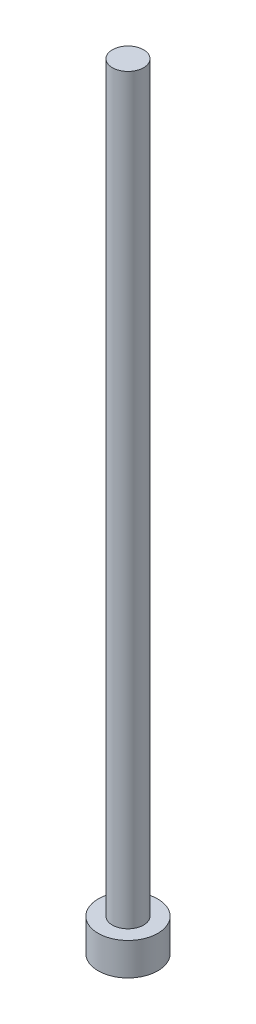
ISO-10303-21;
HEADER;
FILE_DESCRIPTION(('STEP AP214'),'2;1');
FILE_NAME('part.step','',(''),(''),'','','');
FILE_SCHEMA(('AUTOMOTIVE_DESIGN { 1 0 10303 214 1 1 1 1 }'));
ENDSEC;
DATA;
#1=APPLICATION_CONTEXT('core data for automotive mechanical design processes');
#2=APPLICATION_PROTOCOL_DEFINITION('international standard','automotive_design',2000,#1);
#3=PRODUCT_CONTEXT('',#1,'mechanical');
#4=PRODUCT('Part','Part','',(#3));
#5=PRODUCT_RELATED_PRODUCT_CATEGORY('part','',(#4));
#6=PRODUCT_DEFINITION_FORMATION('','',#4);
#7=PRODUCT_DEFINITION_CONTEXT('part definition',#1,'design');
#8=PRODUCT_DEFINITION('design','',#6,#7);
#9=PRODUCT_DEFINITION_SHAPE('','',#8);
#10=(LENGTH_UNIT() NAMED_UNIT(*) SI_UNIT(.MILLI.,.METRE.));
#11=(NAMED_UNIT(*) PLANE_ANGLE_UNIT() SI_UNIT($,.RADIAN.));
#12=(NAMED_UNIT(*) SI_UNIT($,.STERADIAN.) SOLID_ANGLE_UNIT());
#13=UNCERTAINTY_MEASURE_WITH_UNIT(LENGTH_MEASURE(1.E-05),#10,'distance_accuracy_value','');
#14=(GEOMETRIC_REPRESENTATION_CONTEXT(3) GLOBAL_UNCERTAINTY_ASSIGNED_CONTEXT((#13)) GLOBAL_UNIT_ASSIGNED_CONTEXT((#10,
#11,#12)) REPRESENTATION_CONTEXT('',''));
#15=CARTESIAN_POINT('',(0.,0.,0.));
#16=DIRECTION('',(0.,0.,1.));
#17=DIRECTION('',(1.,0.,0.));
#18=AXIS2_PLACEMENT_3D('',#15,#16,#17);
#19=CARTESIAN_POINT('',(0.,2.4,0.));
#20=DIRECTION('',(0.,-1.,0.));
#21=DIRECTION('',(0.,0.,-1.));
#22=AXIS2_PLACEMENT_3D('',#19,#20,#21);
#23=CYLINDRICAL_SURFACE('',#22,2.2);
#24=CARTESIAN_POINT('',(0.,2.4,0.));
#25=DIRECTION('',(0.,1.,0.));
#26=DIRECTION('',(0.,0.,1.));
#27=AXIS2_PLACEMENT_3D('',#24,#25,#26);
#28=CIRCLE('',#27,2.2);
#29=CARTESIAN_POINT('',(0.,2.4,2.2));
#30=VERTEX_POINT('',#29);
#31=EDGE_CURVE('E45',#30,#30,#28,.T.);
#32=ORIENTED_EDGE('',*,*,#31,.F.);
#33=EDGE_LOOP('',(#32));
#34=FACE_BOUND('',#33,.T.);
#35=CARTESIAN_POINT('',(0.,0.,0.));
#36=DIRECTION('',(0.,1.,0.));
#37=DIRECTION('',(0.,0.,1.));
#38=AXIS2_PLACEMENT_3D('',#35,#36,#37);
#39=CIRCLE('',#38,2.2);
#40=CARTESIAN_POINT('',(0.,0.,2.2));
#41=VERTEX_POINT('',#40);
#42=EDGE_CURVE('E40',#41,#41,#39,.T.);
#43=ORIENTED_EDGE('',*,*,#42,.T.);
#44=EDGE_LOOP('',(#43));
#45=FACE_BOUND('',#44,.T.);
#46=ADVANCED_FACE('F37',(#34,#45),#23,.T.);
#47=CARTESIAN_POINT('',(0.,2.4,0.));
#48=DIRECTION('',(0.,1.,0.));
#49=DIRECTION('',(0.,0.,1.));
#50=AXIS2_PLACEMENT_3D('',#47,#48,#49);
#51=PLANE('',#50);
#52=CARTESIAN_POINT('',(0.,2.4,0.));
#53=DIRECTION('',(0.,1.,0.));
#54=DIRECTION('',(0.,0.,1.));
#55=AXIS2_PLACEMENT_3D('',#52,#53,#54);
#56=CIRCLE('',#55,1.15);
#57=CARTESIAN_POINT('',(0.,2.4,-1.15));
#58=VERTEX_POINT('',#57);
#59=EDGE_CURVE('E11',#58,#58,#56,.T.);
#60=ORIENTED_EDGE('',*,*,#59,.F.);
#61=EDGE_LOOP('',(#60));
#62=FACE_BOUND('',#61,.T.);
#63=ORIENTED_EDGE('',*,*,#31,.T.);
#64=EDGE_LOOP('',(#63));
#65=FACE_BOUND('',#64,.T.);
#66=ADVANCED_FACE('F214',(#62,#65),#51,.T.);
#67=CARTESIAN_POINT('',(0.,0.,0.));
#68=DIRECTION('',(0.,1.,0.));
#69=DIRECTION('',(0.,0.,1.));
#70=AXIS2_PLACEMENT_3D('',#67,#68,#69);
#71=PLANE('',#70);
#72=DIRECTION('',(1.,0.,0.));
#73=VECTOR('',#72,1.);
#74=CARTESIAN_POINT('',(0.,0.,0.999999999999996));
#75=LINE('',#74,#73);
#76=CARTESIAN_POINT('',(-0.567890834580024,0.,1.));
#77=VERTEX_POINT('',#76);
#78=CARTESIAN_POINT('',(0.567890834580045,0.,0.99999999999999));
#79=VERTEX_POINT('',#78);
#80=EDGE_CURVE('E53',#77,#79,#75,.T.);
#81=ORIENTED_EDGE('',*,*,#80,.T.);
#82=CARTESIAN_POINT('',(0.,0.,0.));
#83=DIRECTION('',(0.,1.,0.));
#84=DIRECTION('',(0.,0.,1.));
#85=AXIS2_PLACEMENT_3D('',#82,#83,#84);
#86=CIRCLE('',#85,1.15);
#87=CARTESIAN_POINT('',(0.58207998649443,0.,0.991807889322647));
#88=VERTEX_POINT('',#87);
#89=EDGE_CURVE('E162',#79,#88,#86,.T.);
#90=ORIENTED_EDGE('',*,*,#89,.T.);
#91=DIRECTION('',(0.499999999999995,0.,-0.866025403784442));
#92=VECTOR('',#91,1.);
#93=CARTESIAN_POINT('',(0.866025403784441,0.,0.499999999999995));
#94=LINE('',#93,#92);
#95=CARTESIAN_POINT('',(1.14997082107445,0.,0.0081921106773428));
#96=VERTEX_POINT('',#95);
#97=EDGE_CURVE('E165',#88,#96,#94,.T.);
#98=ORIENTED_EDGE('',*,*,#97,.T.);
#99=CARTESIAN_POINT('',(1.14997082107445,0.,-0.00819211067734334));
#100=VERTEX_POINT('',#99);
#101=EDGE_CURVE('E167',#96,#100,#86,.T.);
#102=ORIENTED_EDGE('',*,*,#101,.T.);
#103=DIRECTION('',(-0.500000000000001,0.,-0.866025403784438));
#104=VECTOR('',#103,1.);
#105=CARTESIAN_POINT('',(0.866025403784435,0.,-0.499999999999999));
#106=LINE('',#105,#104);
#107=CARTESIAN_POINT('',(0.582079986494417,0.,-0.991807889322655));
#108=VERTEX_POINT('',#107);
#109=EDGE_CURVE('E170',#100,#108,#106,.T.);
#110=ORIENTED_EDGE('',*,*,#109,.T.);
#111=CARTESIAN_POINT('',(0.567890834580031,0.,-0.999999999999998));
#112=VERTEX_POINT('',#111);
#113=EDGE_CURVE('E173',#108,#112,#86,.T.);
#114=ORIENTED_EDGE('',*,*,#113,.T.);
#115=DIRECTION('',(-1.,0.,0.));
#116=VECTOR('',#115,1.);
#117=CARTESIAN_POINT('',(0.,0.,-0.999999999999996));
#118=LINE('',#117,#116);
#119=CARTESIAN_POINT('',(-0.567890834580038,0.,-0.999999999999994));
#120=VERTEX_POINT('',#119);
#121=EDGE_CURVE('E174',#112,#120,#118,.T.);
#122=ORIENTED_EDGE('',*,*,#121,.T.);
#123=CARTESIAN_POINT('',(-0.582079986494424,0.,-0.991807889322651));
#124=VERTEX_POINT('',#123);
#125=EDGE_CURVE('E177',#120,#124,#86,.T.);
#126=ORIENTED_EDGE('',*,*,#125,.T.);
#127=DIRECTION('',(-0.499999999999995,0.,0.866025403784442));
#128=VECTOR('',#127,1.);
#129=CARTESIAN_POINT('',(-0.866025403784438,0.,-0.499999999999993));
#130=LINE('',#129,#128);
#131=CARTESIAN_POINT('',(-1.14997082107445,0.,-0.00819211067733553));
#132=VERTEX_POINT('',#131);
#133=EDGE_CURVE('E178',#124,#132,#130,.T.);
#134=ORIENTED_EDGE('',*,*,#133,.T.);
#135=CARTESIAN_POINT('',(-1.14997082107445,0.,0.00819211067735191));
#136=VERTEX_POINT('',#135);
#137=EDGE_CURVE('E181',#132,#136,#86,.T.);
#138=ORIENTED_EDGE('',*,*,#137,.T.);
#139=DIRECTION('',(0.500000000000007,0.,0.866025403784435));
#140=VECTOR('',#139,1.);
#141=CARTESIAN_POINT('',(-0.866025403784431,0.,0.500000000000005));
#142=LINE('',#141,#140);
#143=CARTESIAN_POINT('',(-0.582079986494411,0.,0.991807889322659));
#144=VERTEX_POINT('',#143);
#145=EDGE_CURVE('E152',#136,#144,#142,.T.);
#146=ORIENTED_EDGE('',*,*,#145,.T.);
#147=EDGE_CURVE('E166',#144,#77,#86,.T.);
#148=ORIENTED_EDGE('',*,*,#147,.T.);
#149=EDGE_LOOP('',(#81,#90,#98,#102,#110,#114,#122,#126,#134,#138,#146,#148));
#150=FACE_BOUND('',#149,.T.);
#151=ORIENTED_EDGE('',*,*,#42,.F.);
#152=EDGE_LOOP('',(#151));
#153=FACE_BOUND('',#152,.T.);
#154=ADVANCED_FACE('F211',(#150,#153),#71,.F.);
#155=CARTESIAN_POINT('',(0.,57.2,0.));
#156=DIRECTION('',(0.,-1.,0.));
#157=DIRECTION('',(0.,0.,-1.));
#158=AXIS2_PLACEMENT_3D('',#155,#156,#157);
#159=CYLINDRICAL_SURFACE('',#158,1.15);
#160=CARTESIAN_POINT('',(0.,57.2,0.));
#161=DIRECTION('',(0.,1.,0.));
#162=DIRECTION('',(0.,0.,1.));
#163=AXIS2_PLACEMENT_3D('',#160,#161,#162);
#164=CIRCLE('',#163,1.15);
#165=CARTESIAN_POINT('',(0.,57.2,-1.15));
#166=VERTEX_POINT('',#165);
#167=EDGE_CURVE('E202',#166,#166,#164,.T.);
#168=CARTESIAN_POINT('',(0.,57.2,-1.15));
#169=CARTESIAN_POINT('',(0.,56.6291666666667,-1.15));
#170=CARTESIAN_POINT('',(0.,56.0583333333333,-1.15));
#171=CARTESIAN_POINT('',(0.,54.9166666666667,-1.15));
#172=CARTESIAN_POINT('',(0.,54.3458333333333,-1.15));
#173=CARTESIAN_POINT('',(0.,53.2041666666667,-1.15));
#174=CARTESIAN_POINT('',(0.,52.6333333333333,-1.15));
#175=CARTESIAN_POINT('',(0.,51.4916666666667,-1.15));
#176=CARTESIAN_POINT('',(0.,50.9208333333333,-1.15));
#177=CARTESIAN_POINT('',(0.,49.7791666666667,-1.15));
#178=CARTESIAN_POINT('',(0.,49.2083333333333,-1.15));
#179=CARTESIAN_POINT('',(0.,48.0666666666667,-1.15));
#180=CARTESIAN_POINT('',(0.,47.4958333333333,-1.15));
#181=CARTESIAN_POINT('',(0.,46.3541666666667,-1.15));
#182=CARTESIAN_POINT('',(0.,45.7833333333333,-1.15));
#183=CARTESIAN_POINT('',(0.,44.6416666666667,-1.15));
#184=CARTESIAN_POINT('',(0.,44.0708333333333,-1.15));
#185=CARTESIAN_POINT('',(0.,42.9291666666667,-1.15));
#186=CARTESIAN_POINT('',(0.,42.3583333333333,-1.15));
#187=CARTESIAN_POINT('',(0.,41.2166666666667,-1.15));
#188=CARTESIAN_POINT('',(0.,40.6458333333333,-1.15));
#189=CARTESIAN_POINT('',(0.,39.5041666666667,-1.15));
#190=CARTESIAN_POINT('',(0.,38.9333333333333,-1.15));
#191=CARTESIAN_POINT('',(0.,37.7916666666667,-1.15));
#192=CARTESIAN_POINT('',(0.,37.2208333333333,-1.15));
#193=CARTESIAN_POINT('',(0.,36.0791666666667,-1.15));
#194=CARTESIAN_POINT('',(0.,35.5083333333333,-1.15));
#195=CARTESIAN_POINT('',(0.,34.3666666666667,-1.15));
#196=CARTESIAN_POINT('',(0.,33.7958333333333,-1.15));
#197=CARTESIAN_POINT('',(0.,32.6541666666667,-1.15));
#198=CARTESIAN_POINT('',(0.,32.0833333333333,-1.15));
#199=CARTESIAN_POINT('',(0.,30.9416666666667,-1.15));
#200=CARTESIAN_POINT('',(0.,30.3708333333333,-1.15));
#201=CARTESIAN_POINT('',(0.,29.2291666666667,-1.15));
#202=CARTESIAN_POINT('',(0.,28.6583333333333,-1.15));
#203=CARTESIAN_POINT('',(0.,27.5166666666667,-1.15));
#204=CARTESIAN_POINT('',(0.,26.9458333333333,-1.15));
#205=CARTESIAN_POINT('',(0.,25.8041666666667,-1.15));
#206=CARTESIAN_POINT('',(0.,25.2333333333333,-1.15));
#207=CARTESIAN_POINT('',(0.,24.0916666666667,-1.15));
#208=CARTESIAN_POINT('',(0.,23.5208333333333,-1.15));
#209=CARTESIAN_POINT('',(0.,22.3791666666667,-1.15));
#210=CARTESIAN_POINT('',(0.,21.8083333333333,-1.15));
#211=CARTESIAN_POINT('',(0.,20.6666666666667,-1.15));
#212=CARTESIAN_POINT('',(0.,20.0958333333333,-1.15));
#213=CARTESIAN_POINT('',(0.,18.9541666666667,-1.15));
#214=CARTESIAN_POINT('',(0.,18.3833333333333,-1.15));
#215=CARTESIAN_POINT('',(0.,17.2416666666667,-1.15));
#216=CARTESIAN_POINT('',(0.,16.6708333333333,-1.15));
#217=CARTESIAN_POINT('',(0.,15.5291666666667,-1.15));
#218=CARTESIAN_POINT('',(0.,14.9583333333333,-1.15));
#219=CARTESIAN_POINT('',(0.,13.8166666666667,-1.15));
#220=CARTESIAN_POINT('',(0.,13.2458333333333,-1.15));
#221=CARTESIAN_POINT('',(0.,12.1041666666667,-1.15));
#222=CARTESIAN_POINT('',(0.,11.5333333333333,-1.15));
#223=CARTESIAN_POINT('',(0.,10.3916666666667,-1.15));
#224=CARTESIAN_POINT('',(0.,9.82083333333333,-1.15));
#225=CARTESIAN_POINT('',(0.,8.67916666666667,-1.15));
#226=CARTESIAN_POINT('',(0.,8.10833333333333,-1.15));
#227=CARTESIAN_POINT('',(0.,6.96666666666666,-1.15));
#228=CARTESIAN_POINT('',(0.,6.39583333333333,-1.15));
#229=CARTESIAN_POINT('',(0.,5.25416666666666,-1.15));
#230=CARTESIAN_POINT('',(0.,4.68333333333333,-1.15));
#231=CARTESIAN_POINT('',(0.,3.54166666666667,-1.15));
#232=CARTESIAN_POINT('',(0.,2.97083333333333,-1.15));
#233=CARTESIAN_POINT('',(0.,2.4,-1.15));
#234=B_SPLINE_CURVE_WITH_KNOTS('',3,(#168,#169,#170,#171,#172,#173,#174,#175,#176,#177,#178,
#179,#180,#181,#182,#183,#184,#185,#186,#187,#188,#189,#190,#191,#192,#193,#194,#195,#196,#197,
#198,#199,#200,#201,#202,#203,#204,#205,#206,#207,#208,#209,#210,#211,#212,#213,#214,#215,#216,
#217,#218,#219,#220,#221,#222,#223,#224,#225,#226,#227,#228,#229,#230,#231,#232,#233),
.UNSPECIFIED.,.F.,.F.,(4,2,2,2,2,2,2,2,2,2,2,2,2,2,2,2,2,2,2,2,2,2,2,2,2,2,2,2,2,2,2,2,4),(0.,
1.7125,3.425,5.1375,6.85,8.56249999999999,10.275,11.9875,13.7,15.4125,17.125,18.8375,20.55,
22.2625,23.975,25.6875,27.4,29.1125,30.825,32.5375,34.25,35.9625,37.675,39.3875,41.1,42.8125,
44.525,46.2375,47.95,49.6625,51.375,53.0875,54.8),.UNSPECIFIED.);
#235=EDGE_CURVE('BSEAM213',#166,#58,#234,.T.);
#236=ORIENTED_EDGE('',*,*,#167,.F.);
#237=ORIENTED_EDGE('',*,*,#59,.T.);
#238=ORIENTED_EDGE('',*,*,#235,.T.);
#239=ORIENTED_EDGE('',*,*,#235,.F.);
#240=EDGE_LOOP('',(#236,#238,#237,#239));
#241=FACE_BOUND('',#240,.T.);
#242=ADVANCED_FACE('F213',(#241),#159,.T.);
#243=CARTESIAN_POINT('',(0.,57.2,0.));
#244=DIRECTION('',(0.,1.,0.));
#245=DIRECTION('',(0.,0.,1.));
#246=AXIS2_PLACEMENT_3D('',#243,#244,#245);
#247=PLANE('',#246);
#248=ORIENTED_EDGE('',*,*,#167,.T.);
#249=EDGE_LOOP('',(#248));
#250=FACE_BOUND('',#249,.T.);
#251=ADVANCED_FACE('F220',(#250),#247,.T.);
#252=CARTESIAN_POINT('',(0.,1.5,0.999999999999996));
#253=DIRECTION('',(0.,0.,-1.));
#254=DIRECTION('',(-1.,0.,0.));
#255=AXIS2_PLACEMENT_3D('',#252,#253,#254);
#256=PLANE('',#255);
#257=ORIENTED_EDGE('',*,*,#80,.F.);
#258=DIRECTION('',(0.,-1.,0.));
#259=VECTOR('',#258,1.);
#260=CARTESIAN_POINT('',(-0.567890834580024,1.5,1.));
#261=LINE('',#260,#259);
#262=CARTESIAN_POINT('',(-0.567890834580024,1.5,1.));
#263=VERTEX_POINT('',#262);
#264=EDGE_CURVE('E157',#263,#77,#261,.T.);
#265=ORIENTED_EDGE('',*,*,#264,.F.);
#266=DIRECTION('',(1.,0.,0.));
#267=VECTOR('',#266,1.);
#268=CARTESIAN_POINT('',(0.,1.5,0.999999999999996));
#269=LINE('',#268,#267);
#270=CARTESIAN_POINT('',(0.567890834580045,1.5,0.99999999999999));
#271=VERTEX_POINT('',#270);
#272=EDGE_CURVE('E374',#263,#271,#269,.T.);
#273=ORIENTED_EDGE('',*,*,#272,.T.);
#274=DIRECTION('',(0.,-1.,0.));
#275=VECTOR('',#274,1.);
#276=CARTESIAN_POINT('',(0.567890834580045,1.5,0.99999999999999));
#277=LINE('',#276,#275);
#278=EDGE_CURVE('E200',#271,#79,#277,.T.);
#279=ORIENTED_EDGE('',*,*,#278,.T.);
#280=EDGE_LOOP('',(#257,#265,#273,#279));
#281=FACE_BOUND('',#280,.T.);
#282=ADVANCED_FACE('F248',(#281),#256,.T.);
#283=CARTESIAN_POINT('',(0.,1.5,0.));
#284=DIRECTION('',(0.,-1.,0.));
#285=DIRECTION('',(0.,0.,-1.));
#286=AXIS2_PLACEMENT_3D('',#283,#284,#285);
#287=CYLINDRICAL_SURFACE('',#286,1.15);
#288=ORIENTED_EDGE('',*,*,#89,.F.);
#289=ORIENTED_EDGE('',*,*,#278,.F.);
#290=CARTESIAN_POINT('',(0.,1.5,0.));
#291=DIRECTION('',(0.,1.,0.));
#292=DIRECTION('',(0.,0.,1.));
#293=AXIS2_PLACEMENT_3D('',#290,#291,#292);
#294=CIRCLE('',#293,1.15);
#295=CARTESIAN_POINT('',(0.58207998649443,1.5,0.991807889322647));
#296=VERTEX_POINT('',#295);
#297=EDGE_CURVE('E110',#271,#296,#294,.T.);
#298=ORIENTED_EDGE('',*,*,#297,.T.);
#299=DIRECTION('',(0.,-1.,0.));
#300=VECTOR('',#299,1.);
#301=CARTESIAN_POINT('',(0.58207998649443,1.5,0.991807889322647));
#302=LINE('',#301,#300);
#303=EDGE_CURVE('E198',#296,#88,#302,.T.);
#304=ORIENTED_EDGE('',*,*,#303,.T.);
#305=EDGE_LOOP('',(#288,#289,#298,#304));
#306=FACE_BOUND('',#305,.T.);
#307=ADVANCED_FACE('F262',(#306),#287,.F.);
#308=CARTESIAN_POINT('',(0.866025403784441,1.5,0.499999999999995));
#309=DIRECTION('',(-0.866025403784441,0.,-0.499999999999995));
#310=DIRECTION('',(-0.499999999999995,0.,0.866025403784442));
#311=AXIS2_PLACEMENT_3D('',#308,#309,#310);
#312=PLANE('',#311);
#313=ORIENTED_EDGE('',*,*,#97,.F.);
#314=ORIENTED_EDGE('',*,*,#303,.F.);
#315=DIRECTION('',(0.499999999999995,0.,-0.866025403784442));
#316=VECTOR('',#315,1.);
#317=CARTESIAN_POINT('',(0.866025403784441,1.5,0.499999999999995));
#318=LINE('',#317,#316);
#319=CARTESIAN_POINT('',(1.14997082107445,1.5,0.0081921106773428));
#320=VERTEX_POINT('',#319);
#321=EDGE_CURVE('E403',#296,#320,#318,.T.);
#322=ORIENTED_EDGE('',*,*,#321,.T.);
#323=DIRECTION('',(0.,-1.,0.));
#324=VECTOR('',#323,1.);
#325=CARTESIAN_POINT('',(1.14997082107445,1.5,0.0081921106773428));
#326=LINE('',#325,#324);
#327=EDGE_CURVE('E196',#320,#96,#326,.T.);
#328=ORIENTED_EDGE('',*,*,#327,.T.);
#329=EDGE_LOOP('',(#313,#314,#322,#328));
#330=FACE_BOUND('',#329,.T.);
#331=ADVANCED_FACE('F271',(#330),#312,.T.);
#332=ORIENTED_EDGE('',*,*,#101,.F.);
#333=ORIENTED_EDGE('',*,*,#327,.F.);
#334=CARTESIAN_POINT('',(1.14997082107445,1.5,-0.00819211067734334));
#335=VERTEX_POINT('',#334);
#336=EDGE_CURVE('E387',#320,#335,#294,.T.);
#337=ORIENTED_EDGE('',*,*,#336,.T.);
#338=DIRECTION('',(0.,-1.,0.));
#339=VECTOR('',#338,1.);
#340=CARTESIAN_POINT('',(1.14997082107445,1.5,-0.00819211067734334));
#341=LINE('',#340,#339);
#342=EDGE_CURVE('E194',#335,#100,#341,.T.);
#343=ORIENTED_EDGE('',*,*,#342,.T.);
#344=EDGE_LOOP('',(#332,#333,#337,#343));
#345=FACE_BOUND('',#344,.T.);
#346=ADVANCED_FACE('F274',(#345),#287,.F.);
#347=CARTESIAN_POINT('',(0.866025403784435,1.5,-0.499999999999999));
#348=DIRECTION('',(-0.866025403784438,0.,0.500000000000001));
#349=DIRECTION('',(0.500000000000001,0.,0.866025403784438));
#350=AXIS2_PLACEMENT_3D('',#347,#348,#349);
#351=PLANE('',#350);
#352=ORIENTED_EDGE('',*,*,#109,.F.);
#353=ORIENTED_EDGE('',*,*,#342,.F.);
#354=DIRECTION('',(-0.500000000000001,0.,-0.866025403784438));
#355=VECTOR('',#354,1.);
#356=CARTESIAN_POINT('',(0.866025403784435,1.5,-0.499999999999999));
#357=LINE('',#356,#355);
#358=CARTESIAN_POINT('',(0.582079986494417,1.5,-0.991807889322655));
#359=VERTEX_POINT('',#358);
#360=EDGE_CURVE('E390',#335,#359,#357,.T.);
#361=ORIENTED_EDGE('',*,*,#360,.T.);
#362=DIRECTION('',(0.,-1.,0.));
#363=VECTOR('',#362,1.);
#364=CARTESIAN_POINT('',(0.582079986494417,1.5,-0.991807889322655));
#365=LINE('',#364,#363);
#366=EDGE_CURVE('E192',#359,#108,#365,.T.);
#367=ORIENTED_EDGE('',*,*,#366,.T.);
#368=EDGE_LOOP('',(#352,#353,#361,#367));
#369=FACE_BOUND('',#368,.T.);
#370=ADVANCED_FACE('F292',(#369),#351,.T.);
#371=ORIENTED_EDGE('',*,*,#113,.F.);
#372=ORIENTED_EDGE('',*,*,#366,.F.);
#373=CARTESIAN_POINT('',(0.567890834580031,1.5,-0.999999999999998));
#374=VERTEX_POINT('',#373);
#375=EDGE_CURVE('E394',#359,#374,#294,.T.);
#376=ORIENTED_EDGE('',*,*,#375,.T.);
#377=DIRECTION('',(0.,-1.,0.));
#378=VECTOR('',#377,1.);
#379=CARTESIAN_POINT('',(0.567890834580031,1.5,-0.999999999999998));
#380=LINE('',#379,#378);
#381=EDGE_CURVE('E190',#374,#112,#380,.T.);
#382=ORIENTED_EDGE('',*,*,#381,.T.);
#383=EDGE_LOOP('',(#371,#372,#376,#382));
#384=FACE_BOUND('',#383,.T.);
#385=ADVANCED_FACE('F294',(#384),#287,.F.);
#386=CARTESIAN_POINT('',(0.,1.5,-0.999999999999996));
#387=DIRECTION('',(0.,0.,1.));
#388=DIRECTION('',(1.,0.,0.));
#389=AXIS2_PLACEMENT_3D('',#386,#387,#388);
#390=PLANE('',#389);
#391=ORIENTED_EDGE('',*,*,#121,.F.);
#392=ORIENTED_EDGE('',*,*,#381,.F.);
#393=DIRECTION('',(-1.,0.,0.));
#394=VECTOR('',#393,1.);
#395=CARTESIAN_POINT('',(0.,1.5,-0.999999999999996));
#396=LINE('',#395,#394);
#397=CARTESIAN_POINT('',(-0.567890834580038,1.5,-0.999999999999994));
#398=VERTEX_POINT('',#397);
#399=EDGE_CURVE('E397',#374,#398,#396,.T.);
#400=ORIENTED_EDGE('',*,*,#399,.T.);
#401=DIRECTION('',(0.,-1.,0.));
#402=VECTOR('',#401,1.);
#403=CARTESIAN_POINT('',(-0.567890834580038,1.5,-0.999999999999994));
#404=LINE('',#403,#402);
#405=EDGE_CURVE('E188',#398,#120,#404,.T.);
#406=ORIENTED_EDGE('',*,*,#405,.T.);
#407=EDGE_LOOP('',(#391,#392,#400,#406));
#408=FACE_BOUND('',#407,.T.);
#409=ADVANCED_FACE('F311',(#408),#390,.T.);
#410=ORIENTED_EDGE('',*,*,#125,.F.);
#411=ORIENTED_EDGE('',*,*,#405,.F.);
#412=CARTESIAN_POINT('',(-0.582079986494424,1.5,-0.991807889322651));
#413=VERTEX_POINT('',#412);
#414=EDGE_CURVE('E149',#398,#413,#294,.T.);
#415=ORIENTED_EDGE('',*,*,#414,.T.);
#416=DIRECTION('',(0.,-1.,0.));
#417=VECTOR('',#416,1.);
#418=CARTESIAN_POINT('',(-0.582079986494424,1.5,-0.991807889322651));
#419=LINE('',#418,#417);
#420=EDGE_CURVE('E186',#413,#124,#419,.T.);
#421=ORIENTED_EDGE('',*,*,#420,.T.);
#422=EDGE_LOOP('',(#410,#411,#415,#421));
#423=FACE_BOUND('',#422,.T.);
#424=ADVANCED_FACE('F313',(#423),#287,.F.);
#425=CARTESIAN_POINT('',(-0.866025403784438,1.5,-0.499999999999993));
#426=DIRECTION('',(0.866025403784441,0.,0.499999999999995));
#427=DIRECTION('',(0.499999999999995,0.,-0.866025403784442));
#428=AXIS2_PLACEMENT_3D('',#425,#426,#427);
#429=PLANE('',#428);
#430=ORIENTED_EDGE('',*,*,#133,.F.);
#431=ORIENTED_EDGE('',*,*,#420,.F.);
#432=DIRECTION('',(-0.499999999999995,0.,0.866025403784442));
#433=VECTOR('',#432,1.);
#434=CARTESIAN_POINT('',(-0.866025403784438,1.5,-0.499999999999993));
#435=LINE('',#434,#433);
#436=CARTESIAN_POINT('',(-1.14997082107445,1.5,-0.00819211067733553));
#437=VERTEX_POINT('',#436);
#438=EDGE_CURVE('E147',#413,#437,#435,.T.);
#439=ORIENTED_EDGE('',*,*,#438,.T.);
#440=DIRECTION('',(0.,-1.,0.));
#441=VECTOR('',#440,1.);
#442=CARTESIAN_POINT('',(-1.14997082107445,1.5,-0.00819211067733553));
#443=LINE('',#442,#441);
#444=EDGE_CURVE('E143',#437,#132,#443,.T.);
#445=ORIENTED_EDGE('',*,*,#444,.T.);
#446=EDGE_LOOP('',(#430,#431,#439,#445));
#447=FACE_BOUND('',#446,.T.);
#448=ADVANCED_FACE('F330',(#447),#429,.T.);
#449=ORIENTED_EDGE('',*,*,#137,.F.);
#450=ORIENTED_EDGE('',*,*,#444,.F.);
#451=CARTESIAN_POINT('',(-1.14997082107445,1.5,0.00819211067735191));
#452=VERTEX_POINT('',#451);
#453=EDGE_CURVE('E138',#437,#452,#294,.T.);
#454=ORIENTED_EDGE('',*,*,#453,.T.);
#455=DIRECTION('',(0.,-1.,0.));
#456=VECTOR('',#455,1.);
#457=CARTESIAN_POINT('',(-1.14997082107445,1.5,0.00819211067735191));
#458=LINE('',#457,#456);
#459=EDGE_CURVE('E142',#452,#136,#458,.T.);
#460=ORIENTED_EDGE('',*,*,#459,.T.);
#461=EDGE_LOOP('',(#449,#450,#454,#460));
#462=FACE_BOUND('',#461,.T.);
#463=ADVANCED_FACE('F141',(#462),#287,.F.);
#464=CARTESIAN_POINT('',(-0.866025403784431,1.5,0.500000000000005));
#465=DIRECTION('',(0.866025403784434,0.,-0.500000000000007));
#466=DIRECTION('',(-0.500000000000007,0.,-0.866025403784435));
#467=AXIS2_PLACEMENT_3D('',#464,#465,#466);
#468=PLANE('',#467);
#469=ORIENTED_EDGE('',*,*,#145,.F.);
#470=ORIENTED_EDGE('',*,*,#459,.F.);
#471=DIRECTION('',(0.500000000000007,0.,0.866025403784435));
#472=VECTOR('',#471,1.);
#473=CARTESIAN_POINT('',(-0.866025403784431,1.5,0.500000000000005));
#474=LINE('',#473,#472);
#475=CARTESIAN_POINT('',(-0.582079986494411,1.5,0.991807889322659));
#476=VERTEX_POINT('',#475);
#477=EDGE_CURVE('E146',#452,#476,#474,.T.);
#478=ORIENTED_EDGE('',*,*,#477,.T.);
#479=DIRECTION('',(0.,-1.,0.));
#480=VECTOR('',#479,1.);
#481=CARTESIAN_POINT('',(-0.582079986494411,1.5,0.991807889322659));
#482=LINE('',#481,#480);
#483=EDGE_CURVE('E101',#476,#144,#482,.T.);
#484=ORIENTED_EDGE('',*,*,#483,.T.);
#485=EDGE_LOOP('',(#469,#470,#478,#484));
#486=FACE_BOUND('',#485,.T.);
#487=ADVANCED_FACE('F150',(#486),#468,.T.);
#488=ORIENTED_EDGE('',*,*,#147,.F.);
#489=ORIENTED_EDGE('',*,*,#483,.F.);
#490=EDGE_CURVE('E61',#476,#263,#294,.T.);
#491=ORIENTED_EDGE('',*,*,#490,.T.);
#492=ORIENTED_EDGE('',*,*,#264,.T.);
#493=EDGE_LOOP('',(#488,#489,#491,#492));
#494=FACE_BOUND('',#493,.T.);
#495=ADVANCED_FACE('F275',(#494),#287,.F.);
#496=CARTESIAN_POINT('',(0.,1.5,0.));
#497=DIRECTION('',(0.,1.,0.));
#498=DIRECTION('',(0.,0.,1.));
#499=AXIS2_PLACEMENT_3D('',#496,#497,#498);
#500=PLANE('',#499);
#501=ORIENTED_EDGE('',*,*,#272,.F.);
#502=ORIENTED_EDGE('',*,*,#490,.F.);
#503=ORIENTED_EDGE('',*,*,#477,.F.);
#504=ORIENTED_EDGE('',*,*,#453,.F.);
#505=ORIENTED_EDGE('',*,*,#438,.F.);
#506=ORIENTED_EDGE('',*,*,#414,.F.);
#507=ORIENTED_EDGE('',*,*,#399,.F.);
#508=ORIENTED_EDGE('',*,*,#375,.F.);
#509=ORIENTED_EDGE('',*,*,#360,.F.);
#510=ORIENTED_EDGE('',*,*,#336,.F.);
#511=ORIENTED_EDGE('',*,*,#321,.F.);
#512=ORIENTED_EDGE('',*,*,#297,.F.);
#513=EDGE_LOOP('',(#501,#502,#503,#504,#505,#506,#507,#508,#509,#510,#511,#512));
#514=FACE_BOUND('',#513,.T.);
#515=ADVANCED_FACE('F155',(#514),#500,.F.);
#516=CLOSED_SHELL('',(#46,#66,#154,#242,#251,#282,#307,#331,#346,#370,#385,#409,#424,#448,#463,
#487,#495,#515));
#517=MANIFOLD_SOLID_BREP('B2',#516);
#518=ADVANCED_BREP_SHAPE_REPRESENTATION('',(#18,#517),#14);
#519=SHAPE_DEFINITION_REPRESENTATION(#9,#518);
ENDSEC;
END-ISO-10303-21;
